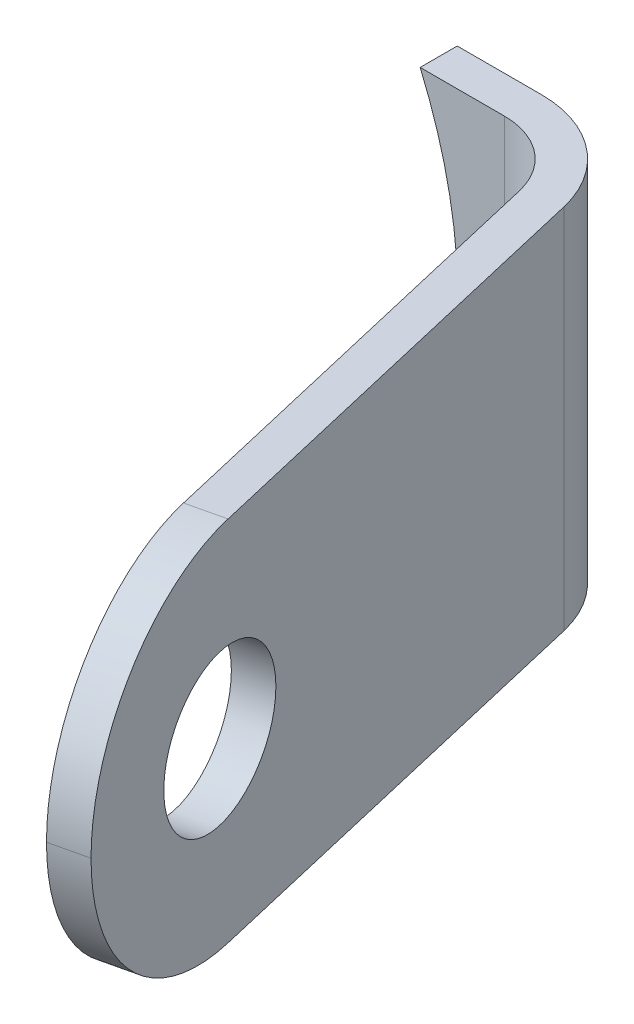
ISO-10303-21;
HEADER;
FILE_DESCRIPTION(('STEP AP214'),'2;1');
FILE_NAME('part.step','',(''),(''),'','','');
FILE_SCHEMA(('AUTOMOTIVE_DESIGN { 1 0 10303 214 1 1 1 1 }'));
ENDSEC;
DATA;
#1=APPLICATION_CONTEXT('core data for automotive mechanical design processes');
#2=APPLICATION_PROTOCOL_DEFINITION('international standard','automotive_design',2000,#1);
#3=PRODUCT_CONTEXT('',#1,'mechanical');
#4=PRODUCT('Part','Part','',(#3));
#5=PRODUCT_RELATED_PRODUCT_CATEGORY('part','',(#4));
#6=PRODUCT_DEFINITION_FORMATION('','',#4);
#7=PRODUCT_DEFINITION_CONTEXT('part definition',#1,'design');
#8=PRODUCT_DEFINITION('design','',#6,#7);
#9=PRODUCT_DEFINITION_SHAPE('','',#8);
#10=(LENGTH_UNIT() NAMED_UNIT(*) SI_UNIT(.MILLI.,.METRE.));
#11=(NAMED_UNIT(*) PLANE_ANGLE_UNIT() SI_UNIT($,.RADIAN.));
#12=(NAMED_UNIT(*) SI_UNIT($,.STERADIAN.) SOLID_ANGLE_UNIT());
#13=UNCERTAINTY_MEASURE_WITH_UNIT(LENGTH_MEASURE(1.E-05),#10,'distance_accuracy_value','');
#14=(GEOMETRIC_REPRESENTATION_CONTEXT(3) GLOBAL_UNCERTAINTY_ASSIGNED_CONTEXT((#13)) GLOBAL_UNIT_ASSIGNED_CONTEXT((#10,
#11,#12)) REPRESENTATION_CONTEXT('',''));
#15=CARTESIAN_POINT('',(0.,0.,0.));
#16=DIRECTION('',(0.,0.,1.));
#17=DIRECTION('',(1.,0.,0.));
#18=AXIS2_PLACEMENT_3D('',#15,#16,#17);
#19=CARTESIAN_POINT('',(-15.1120931920497,2.5146,-13.5720892422123));
#20=DIRECTION('',(0.,0.,1.));
#21=DIRECTION('',(1.,0.,0.));
#22=AXIS2_PLACEMENT_3D('',#19,#20,#21);
#23=PLANE('',#22);
#24=DIRECTION('',(0.,-1.,0.));
#25=VECTOR('',#24,1.);
#26=CARTESIAN_POINT('',(-15.1120931920497,2.5146,-13.5720892422123));
#27=LINE('',#26,#25);
#28=CARTESIAN_POINT('',(-15.1120931920497,2.5146,-13.5720892422123));
#29=VERTEX_POINT('',#28);
#30=CARTESIAN_POINT('',(-15.1120931920497,-2.5146,-13.5720892422123));
#31=VERTEX_POINT('',#30);
#32=EDGE_CURVE('E160',#29,#31,#27,.T.);
#33=ORIENTED_EDGE('',*,*,#32,.T.);
#34=DIRECTION('',(-1.,0.,0.));
#35=VECTOR('',#34,1.);
#36=CARTESIAN_POINT('',(-15.1120931920497,-2.5146,-13.5720892422123));
#37=LINE('',#36,#35);
#38=CARTESIAN_POINT('',(-16.2671092584409,-2.5146,-13.5720892422123));
#39=VERTEX_POINT('',#38);
#40=EDGE_CURVE('E119',#31,#39,#37,.T.);
#41=ORIENTED_EDGE('',*,*,#40,.T.);
#42=CARTESIAN_POINT('',(-22.098,0.,-13.5720892422123));
#43=DIRECTION('',(0.,0.,1.));
#44=DIRECTION('',(1.,0.,0.));
#45=AXIS2_PLACEMENT_3D('',#42,#43,#44);
#46=CIRCLE('',#45,6.35);
#47=CARTESIAN_POINT('',(-16.2671092584409,2.5146,-13.5720892422123));
#48=VERTEX_POINT('',#47);
#49=EDGE_CURVE('E127',#39,#48,#46,.T.);
#50=ORIENTED_EDGE('',*,*,#49,.T.);
#51=DIRECTION('',(-1.,0.,0.));
#52=VECTOR('',#51,1.);
#53=CARTESIAN_POINT('',(-15.1120931920497,2.5146,-13.5720892422123));
#54=LINE('',#53,#52);
#55=EDGE_CURVE('E149',#29,#48,#54,.T.);
#56=ORIENTED_EDGE('',*,*,#55,.F.);
#57=EDGE_LOOP('',(#33,#41,#50,#56));
#58=FACE_BOUND('',#57,.T.);
#59=ADVANCED_FACE('F35',(#58),#23,.F.);
#60=CARTESIAN_POINT('',(-15.1458931468406,2.5146,-13.0640892422123));
#61=DIRECTION('',(0.,0.,-1.));
#62=DIRECTION('',(-1.,0.,0.));
#63=AXIS2_PLACEMENT_3D('',#60,#61,#62);
#64=PLANE('',#63);
#65=DIRECTION('',(1.,0.,0.));
#66=VECTOR('',#65,1.);
#67=CARTESIAN_POINT('',(-15.1458931468406,2.5146,-13.0640892422123));
#68=LINE('',#67,#66);
#69=CARTESIAN_POINT('',(-16.2671092584409,2.5146,-13.0640892422123));
#70=VERTEX_POINT('',#69);
#71=CARTESIAN_POINT('',(-15.1120931920497,2.5146,-13.0640892422123));
#72=VERTEX_POINT('',#71);
#73=EDGE_CURVE('E131',#70,#72,#68,.T.);
#74=ORIENTED_EDGE('',*,*,#73,.F.);
#75=CARTESIAN_POINT('',(-22.098,0.,-13.0640892422123));
#76=DIRECTION('',(0.,0.,1.));
#77=DIRECTION('',(1.,0.,0.));
#78=AXIS2_PLACEMENT_3D('',#75,#76,#77);
#79=CIRCLE('',#78,6.35);
#80=CARTESIAN_POINT('',(-16.2671092584409,-2.5146,-13.0640892422123));
#81=VERTEX_POINT('',#80);
#82=EDGE_CURVE('E125',#81,#70,#79,.T.);
#83=ORIENTED_EDGE('',*,*,#82,.F.);
#84=DIRECTION('',(1.,0.,0.));
#85=VECTOR('',#84,1.);
#86=CARTESIAN_POINT('',(-15.1458931468406,-2.5146,-13.0640892422123));
#87=LINE('',#86,#85);
#88=CARTESIAN_POINT('',(-15.1120931920497,-2.5146,-13.0640892422123));
#89=VERTEX_POINT('',#88);
#90=EDGE_CURVE('E106',#81,#89,#87,.T.);
#91=ORIENTED_EDGE('',*,*,#90,.T.);
#92=DIRECTION('',(0.,-1.,0.));
#93=VECTOR('',#92,1.);
#94=CARTESIAN_POINT('',(-15.1120931920497,2.5146,-13.0640892422123));
#95=LINE('',#94,#93);
#96=EDGE_CURVE('E167',#72,#89,#95,.T.);
#97=ORIENTED_EDGE('',*,*,#96,.F.);
#98=EDGE_LOOP('',(#74,#83,#91,#97));
#99=FACE_BOUND('',#98,.T.);
#100=ADVANCED_FACE('F130',(#99),#64,.F.);
#101=CARTESIAN_POINT('',(-15.1120931920497,2.5146,-12.0480892422123));
#102=DIRECTION('',(0.,-1.,0.));
#103=DIRECTION('',(0.,0.,-1.));
#104=AXIS2_PLACEMENT_3D('',#101,#102,#103);
#105=CYLINDRICAL_SURFACE('',#104,1.016);
#106=ORIENTED_EDGE('',*,*,#96,.T.);
#107=CARTESIAN_POINT('',(-15.1120931920497,-2.5146,-12.0480892422123));
#108=DIRECTION('',(0.,-1.,0.));
#109=DIRECTION('',(0.,0.,-1.));
#110=AXIS2_PLACEMENT_3D('',#107,#108,#109);
#111=CIRCLE('',#110,1.016);
#112=CARTESIAN_POINT('',(-14.1227138256258,-2.5146,-12.2791400359667));
#113=VERTEX_POINT('',#112);
#114=EDGE_CURVE('E115',#89,#113,#111,.T.);
#115=ORIENTED_EDGE('',*,*,#114,.T.);
#116=DIRECTION('',(0.,-1.,0.));
#117=VECTOR('',#116,1.);
#118=CARTESIAN_POINT('',(-14.1227138256258,2.5146,-12.2791400359667));
#119=LINE('',#118,#117);
#120=CARTESIAN_POINT('',(-14.1227138256258,2.5146,-12.2791400359667));
#121=VERTEX_POINT('',#120);
#122=EDGE_CURVE('E165',#121,#113,#119,.T.);
#123=ORIENTED_EDGE('',*,*,#122,.F.);
#124=CARTESIAN_POINT('',(-15.1120931920497,2.5146,-12.0480892422123));
#125=DIRECTION('',(0.,-1.,0.));
#126=DIRECTION('',(0.,0.,-1.));
#127=AXIS2_PLACEMENT_3D('',#124,#125,#126);
#128=CIRCLE('',#127,1.016);
#129=EDGE_CURVE('E152',#72,#121,#128,.T.);
#130=ORIENTED_EDGE('',*,*,#129,.F.);
#131=EDGE_LOOP('',(#106,#115,#123,#130));
#132=FACE_BOUND('',#131,.T.);
#133=ADVANCED_FACE('F203',(#132),#105,.F.);
#134=CARTESIAN_POINT('',(-14.1227138256258,2.5146,-12.2791400359667));
#135=DIRECTION('',(0.973798588999959,0.,-0.227412198577141));
#136=DIRECTION('',(-0.227412198577141,0.,-0.973798588999959));
#137=AXIS2_PLACEMENT_3D('',#134,#135,#136);
#138=PLANE('',#137);
#139=CARTESIAN_POINT('',(-12.6865736188687,0.,-6.12946417998241));
#140=DIRECTION('',(0.973798588999959,0.,-0.227412198577141));
#141=DIRECTION('',(-0.227412198577141,0.,-0.973798588999959));
#142=AXIS2_PLACEMENT_3D('',#139,#140,#141);
#143=CIRCLE('',#142,1.0287);
#144=CARTESIAN_POINT('',(-12.920512547545,0.,-7.13121078848666));
#145=VERTEX_POINT('',#144);
#146=EDGE_CURVE('E39',#145,#145,#143,.T.);
#147=ORIENTED_EDGE('',*,*,#146,.T.);
#148=EDGE_LOOP('',(#147));
#149=FACE_BOUND('',#148,.T.);
#150=DIRECTION('',(0.227412198577141,0.,0.973798588999959));
#151=VECTOR('',#150,1.);
#152=CARTESIAN_POINT('',(-14.1227138256258,-2.5146,-12.2791400359667));
#153=LINE('',#152,#151);
#154=CARTESIAN_POINT('',(-12.7208441747417,-2.5146,-6.27621364708295));
#155=VERTEX_POINT('',#154);
#156=EDGE_CURVE('E142',#113,#155,#153,.T.);
#157=ORIENTED_EDGE('',*,*,#156,.T.);
#158=CARTESIAN_POINT('',(-12.7208441747417,0.,-6.27621364708295));
#159=DIRECTION('',(0.973798588999959,0.,-0.227412198577141));
#160=DIRECTION('',(-0.227412198577141,0.,-0.973798588999959));
#161=AXIS2_PLACEMENT_3D('',#158,#159,#160);
#162=CIRCLE('',#161,2.5146);
#163=CARTESIAN_POINT('',(-12.1489934601996,0.,-3.82749971518366));
#164=VERTEX_POINT('',#163);
#165=EDGE_CURVE('E44',#155,#164,#162,.F.);
#166=ORIENTED_EDGE('',*,*,#165,.T.);
#167=CARTESIAN_POINT('',(-12.7208441747417,0.,-6.27621364708295));
#168=DIRECTION('',(0.973798588999959,0.,-0.227412198577141));
#169=DIRECTION('',(-0.227412198577141,0.,-0.973798588999959));
#170=AXIS2_PLACEMENT_3D('',#167,#168,#169);
#171=CIRCLE('',#170,2.5146);
#172=CARTESIAN_POINT('',(-12.7208441747417,2.5146,-6.27621364708295));
#173=VERTEX_POINT('',#172);
#174=EDGE_CURVE('E52',#164,#173,#171,.F.);
#175=ORIENTED_EDGE('',*,*,#174,.T.);
#176=DIRECTION('',(0.227412198577141,0.,0.973798588999959));
#177=VECTOR('',#176,1.);
#178=CARTESIAN_POINT('',(-14.1227138256258,2.5146,-12.2791400359667));
#179=LINE('',#178,#177);
#180=EDGE_CURVE('E154',#121,#173,#179,.T.);
#181=ORIENTED_EDGE('',*,*,#180,.F.);
#182=ORIENTED_EDGE('',*,*,#122,.T.);
#183=EDGE_LOOP('',(#157,#166,#175,#181,#182));
#184=FACE_BOUND('',#183,.T.);
#185=ADVANCED_FACE('F199',(#149,#184),#138,.F.);
#186=CARTESIAN_POINT('',(-13.6280241424138,2.5146,-12.3946654328439));
#187=DIRECTION('',(-0.973798588999959,0.,0.227412198577141));
#188=DIRECTION('',(0.227412198577141,0.,0.973798588999959));
#189=AXIS2_PLACEMENT_3D('',#186,#187,#188);
#190=PLANE('',#189);
#191=CARTESIAN_POINT('',(-12.1918839356567,0.,-6.24498957685959));
#192=DIRECTION('',(0.973798588999959,0.,-0.227412198577141));
#193=DIRECTION('',(-0.227412198577141,0.,-0.973798588999959));
#194=AXIS2_PLACEMENT_3D('',#191,#192,#193);
#195=CIRCLE('',#194,1.0287);
#196=CARTESIAN_POINT('',(-12.425822864333,0.,-7.24673618536385));
#197=VERTEX_POINT('',#196);
#198=EDGE_CURVE('E136',#197,#197,#195,.T.);
#199=ORIENTED_EDGE('',*,*,#198,.F.);
#200=EDGE_LOOP('',(#199));
#201=FACE_BOUND('',#200,.T.);
#202=CARTESIAN_POINT('',(-12.2261544915297,0.,-6.39173904396014));
#203=DIRECTION('',(-0.973798588999959,0.,0.227412198577141));
#204=DIRECTION('',(0.227412198577141,0.,0.973798588999959));
#205=AXIS2_PLACEMENT_3D('',#202,#203,#204);
#206=CIRCLE('',#205,2.5146);
#207=CARTESIAN_POINT('',(-12.2261544915297,2.5146,-6.39173904396014));
#208=VERTEX_POINT('',#207);
#209=CARTESIAN_POINT('',(-11.6543037769876,0.,-3.94302511206084));
#210=VERTEX_POINT('',#209);
#211=EDGE_CURVE('E169',#208,#210,#206,.F.);
#212=ORIENTED_EDGE('',*,*,#211,.T.);
#213=CARTESIAN_POINT('',(-12.2261544915297,0.,-6.39173904396014));
#214=DIRECTION('',(-0.973798588999959,0.,0.227412198577141));
#215=DIRECTION('',(0.227412198577141,0.,0.973798588999959));
#216=AXIS2_PLACEMENT_3D('',#213,#214,#215);
#217=CIRCLE('',#216,2.5146);
#218=CARTESIAN_POINT('',(-12.2261544915297,-2.5146,-6.39173904396014));
#219=VERTEX_POINT('',#218);
#220=EDGE_CURVE('E171',#210,#219,#217,.F.);
#221=ORIENTED_EDGE('',*,*,#220,.T.);
#222=DIRECTION('',(-0.227412198577141,0.,-0.973798588999959));
#223=VECTOR('',#222,1.);
#224=CARTESIAN_POINT('',(-13.6280241424138,-2.5146,-12.3946654328439));
#225=LINE('',#224,#223);
#226=CARTESIAN_POINT('',(-13.6280241424138,-2.5146,-12.3946654328439));
#227=VERTEX_POINT('',#226);
#228=EDGE_CURVE('E144',#219,#227,#225,.T.);
#229=ORIENTED_EDGE('',*,*,#228,.T.);
#230=DIRECTION('',(0.,-1.,0.));
#231=VECTOR('',#230,1.);
#232=CARTESIAN_POINT('',(-13.6280241424138,2.5146,-12.3946654328439));
#233=LINE('',#232,#231);
#234=CARTESIAN_POINT('',(-13.6280241424138,2.5146,-12.3946654328439));
#235=VERTEX_POINT('',#234);
#236=EDGE_CURVE('E162',#235,#227,#233,.T.);
#237=ORIENTED_EDGE('',*,*,#236,.F.);
#238=DIRECTION('',(-0.227412198577141,0.,-0.973798588999959));
#239=VECTOR('',#238,1.);
#240=CARTESIAN_POINT('',(-13.6280241424138,2.5146,-12.3946654328439));
#241=LINE('',#240,#239);
#242=EDGE_CURVE('E156',#208,#235,#241,.T.);
#243=ORIENTED_EDGE('',*,*,#242,.F.);
#244=EDGE_LOOP('',(#212,#221,#229,#237,#243));
#245=FACE_BOUND('',#244,.T.);
#246=ADVANCED_FACE('F191',(#201,#245),#190,.F.);
#247=CARTESIAN_POINT('',(-15.1120931920497,2.5146,-12.0480892422123));
#248=DIRECTION('',(0.,-1.,0.));
#249=DIRECTION('',(0.,0.,-1.));
#250=AXIS2_PLACEMENT_3D('',#247,#248,#249);
#251=CYLINDRICAL_SURFACE('',#250,1.524);
#252=ORIENTED_EDGE('',*,*,#236,.T.);
#253=CARTESIAN_POINT('',(-15.1120931920497,-2.5146,-12.0480892422123));
#254=DIRECTION('',(0.,1.,0.));
#255=DIRECTION('',(0.,0.,-1.));
#256=AXIS2_PLACEMENT_3D('',#253,#254,#255);
#257=CIRCLE('',#256,1.524);
#258=EDGE_CURVE('E146',#227,#31,#257,.T.);
#259=ORIENTED_EDGE('',*,*,#258,.T.);
#260=ORIENTED_EDGE('',*,*,#32,.F.);
#261=CARTESIAN_POINT('',(-15.1120931920497,2.5146,-12.0480892422123));
#262=DIRECTION('',(0.,1.,0.));
#263=DIRECTION('',(0.,0.,-1.));
#264=AXIS2_PLACEMENT_3D('',#261,#262,#263);
#265=CIRCLE('',#264,1.524);
#266=EDGE_CURVE('E158',#235,#29,#265,.T.);
#267=ORIENTED_EDGE('',*,*,#266,.F.);
#268=EDGE_LOOP('',(#252,#259,#260,#267));
#269=FACE_BOUND('',#268,.T.);
#270=ADVANCED_FACE('F196',(#269),#251,.T.);
#271=CARTESIAN_POINT('',(-15.1120931920497,2.5146,-12.0480892422123));
#272=DIRECTION('',(0.,-1.,0.));
#273=DIRECTION('',(0.,0.,-1.));
#274=AXIS2_PLACEMENT_3D('',#271,#272,#273);
#275=PLANE('',#274);
#276=ORIENTED_EDGE('',*,*,#180,.T.);
#277=DIRECTION('',(0.973798588999959,0.,-0.22741219857714));
#278=VECTOR('',#277,1.);
#279=CARTESIAN_POINT('',(-13.7102235411657,2.5146,-6.04516285332858));
#280=LINE('',#279,#278);
#281=EDGE_CURVE('E11',#173,#208,#280,.T.);
#282=ORIENTED_EDGE('',*,*,#281,.T.);
#283=ORIENTED_EDGE('',*,*,#242,.T.);
#284=ORIENTED_EDGE('',*,*,#266,.T.);
#285=ORIENTED_EDGE('',*,*,#55,.T.);
#286=DIRECTION('',(0.,0.,-1.));
#287=VECTOR('',#286,1.);
#288=CARTESIAN_POINT('',(-16.2671092584409,2.5146,-13.0640892422123));
#289=LINE('',#288,#287);
#290=EDGE_CURVE('E128',#70,#48,#289,.T.);
#291=ORIENTED_EDGE('',*,*,#290,.F.);
#292=ORIENTED_EDGE('',*,*,#73,.T.);
#293=ORIENTED_EDGE('',*,*,#129,.T.);
#294=EDGE_LOOP('',(#276,#282,#283,#284,#285,#291,#292,#293));
#295=FACE_BOUND('',#294,.T.);
#296=ADVANCED_FACE('F188',(#295),#275,.F.);
#297=CARTESIAN_POINT('',(-15.1120931920497,-2.5146,-12.0480892422123));
#298=DIRECTION('',(0.,-1.,0.));
#299=DIRECTION('',(0.,0.,-1.));
#300=AXIS2_PLACEMENT_3D('',#297,#298,#299);
#301=PLANE('',#300);
#302=ORIENTED_EDGE('',*,*,#228,.F.);
#303=DIRECTION('',(0.973798588999959,0.,-0.22741219857714));
#304=VECTOR('',#303,1.);
#305=CARTESIAN_POINT('',(-12.7208441747417,-2.5146,-6.27621364708295));
#306=LINE('',#305,#304);
#307=EDGE_CURVE('E173',#219,#155,#306,.F.);
#308=ORIENTED_EDGE('',*,*,#307,.T.);
#309=ORIENTED_EDGE('',*,*,#156,.F.);
#310=ORIENTED_EDGE('',*,*,#114,.F.);
#311=ORIENTED_EDGE('',*,*,#90,.F.);
#312=DIRECTION('',(0.,0.,-1.));
#313=VECTOR('',#312,1.);
#314=CARTESIAN_POINT('',(-16.2671092584409,-2.5146,-13.0640892422123));
#315=LINE('',#314,#313);
#316=EDGE_CURVE('E111',#81,#39,#315,.T.);
#317=ORIENTED_EDGE('',*,*,#316,.T.);
#318=ORIENTED_EDGE('',*,*,#40,.F.);
#319=ORIENTED_EDGE('',*,*,#258,.F.);
#320=EDGE_LOOP('',(#302,#308,#309,#310,#311,#317,#318,#319));
#321=FACE_BOUND('',#320,.T.);
#322=ADVANCED_FACE('F109',(#321),#301,.T.);
#323=CARTESIAN_POINT('',(-13.7102235411657,0.,-6.04516285332858));
#324=DIRECTION('',(0.973798588999959,0.,-0.22741219857714));
#325=DIRECTION('',(-0.22741219857714,0.,-0.973798588999959));
#326=AXIS2_PLACEMENT_3D('',#323,#324,#325);
#327=CYLINDRICAL_SURFACE('',#326,2.5146);
#328=ORIENTED_EDGE('',*,*,#281,.F.);
#329=ORIENTED_EDGE('',*,*,#174,.F.);
#330=DIRECTION('',(0.973798588999959,0.,-0.22741219857714));
#331=VECTOR('',#330,1.);
#332=CARTESIAN_POINT('',(-11.6543037769876,0.,-3.94302511206084));
#333=LINE('',#332,#331);
#334=EDGE_CURVE('E138',#210,#164,#333,.F.);
#335=ORIENTED_EDGE('',*,*,#334,.F.);
#336=ORIENTED_EDGE('',*,*,#211,.F.);
#337=EDGE_LOOP('',(#328,#329,#335,#336));
#338=FACE_BOUND('',#337,.T.);
#339=ADVANCED_FACE('F37',(#338),#327,.T.);
#340=CARTESIAN_POINT('',(-12.2261544915297,0.,-6.39173904396014));
#341=DIRECTION('',(-0.973798588999959,0.,0.22741219857714));
#342=DIRECTION('',(0.22741219857714,0.,0.973798588999959));
#343=AXIS2_PLACEMENT_3D('',#340,#341,#342);
#344=CYLINDRICAL_SURFACE('',#343,2.5146);
#345=ORIENTED_EDGE('',*,*,#165,.F.);
#346=ORIENTED_EDGE('',*,*,#307,.F.);
#347=ORIENTED_EDGE('',*,*,#220,.F.);
#348=ORIENTED_EDGE('',*,*,#334,.T.);
#349=EDGE_LOOP('',(#345,#346,#347,#348));
#350=FACE_BOUND('',#349,.T.);
#351=ADVANCED_FACE('F181',(#350),#344,.T.);
#352=CARTESIAN_POINT('',(-22.098,0.,-13.0640892422123));
#353=DIRECTION('',(0.,0.,-1.));
#354=DIRECTION('',(-1.,0.,0.));
#355=AXIS2_PLACEMENT_3D('',#352,#353,#354);
#356=CYLINDRICAL_SURFACE('',#355,6.35);
#357=ORIENTED_EDGE('',*,*,#49,.F.);
#358=ORIENTED_EDGE('',*,*,#316,.F.);
#359=ORIENTED_EDGE('',*,*,#82,.T.);
#360=ORIENTED_EDGE('',*,*,#290,.T.);
#361=EDGE_LOOP('',(#357,#358,#359,#360));
#362=FACE_BOUND('',#361,.T.);
#363=ADVANCED_FACE('F123',(#362),#356,.F.);
#364=CARTESIAN_POINT('',(-12.1918839356567,0.,-6.24498957685959));
#365=DIRECTION('',(0.973798588999959,0.,-0.227412198577141));
#366=DIRECTION('',(-0.227412198577141,0.,-0.973798588999959));
#367=AXIS2_PLACEMENT_3D('',#364,#365,#366);
#368=CYLINDRICAL_SURFACE('',#367,1.0287);
#369=ORIENTED_EDGE('',*,*,#198,.T.);
#370=EDGE_LOOP('',(#369));
#371=FACE_BOUND('',#370,.T.);
#372=ORIENTED_EDGE('',*,*,#146,.F.);
#373=EDGE_LOOP('',(#372));
#374=FACE_BOUND('',#373,.T.);
#375=ADVANCED_FACE('F222',(#371,#374),#368,.F.);
#376=CLOSED_SHELL('',(#59,#100,#133,#185,#246,#270,#296,#322,#339,#351,#363,#375));
#377=MANIFOLD_SOLID_BREP('B2',#376);
#378=ADVANCED_BREP_SHAPE_REPRESENTATION('',(#18,#377),#14);
#379=SHAPE_DEFINITION_REPRESENTATION(#9,#378);
ENDSEC;
END-ISO-10303-21;
